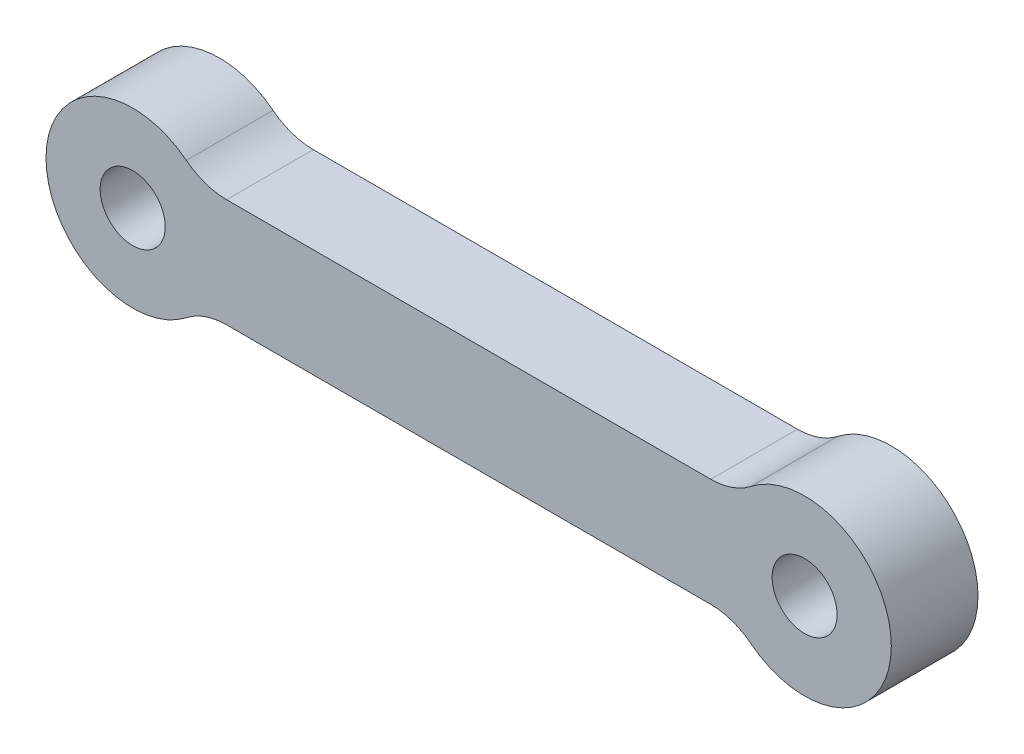
ISO-10303-21;
HEADER;
FILE_DESCRIPTION(('STEP AP214'),'2;1');
FILE_NAME('part.step','',(''),(''),'','','');
FILE_SCHEMA(('AUTOMOTIVE_DESIGN { 1 0 10303 214 1 1 1 1 }'));
ENDSEC;
DATA;
#1=APPLICATION_CONTEXT('core data for automotive mechanical design processes');
#2=APPLICATION_PROTOCOL_DEFINITION('international standard','automotive_design',2000,#1);
#3=PRODUCT_CONTEXT('',#1,'mechanical');
#4=PRODUCT('Part','Part','',(#3));
#5=PRODUCT_RELATED_PRODUCT_CATEGORY('part','',(#4));
#6=PRODUCT_DEFINITION_FORMATION('','',#4);
#7=PRODUCT_DEFINITION_CONTEXT('part definition',#1,'design');
#8=PRODUCT_DEFINITION('design','',#6,#7);
#9=PRODUCT_DEFINITION_SHAPE('','',#8);
#10=(LENGTH_UNIT() NAMED_UNIT(*) SI_UNIT(.MILLI.,.METRE.));
#11=(NAMED_UNIT(*) PLANE_ANGLE_UNIT() SI_UNIT($,.RADIAN.));
#12=(NAMED_UNIT(*) SI_UNIT($,.STERADIAN.) SOLID_ANGLE_UNIT());
#13=UNCERTAINTY_MEASURE_WITH_UNIT(LENGTH_MEASURE(1.E-05),#10,'distance_accuracy_value','');
#14=(GEOMETRIC_REPRESENTATION_CONTEXT(3) GLOBAL_UNCERTAINTY_ASSIGNED_CONTEXT((#13)) GLOBAL_UNIT_ASSIGNED_CONTEXT((#10,
#11,#12)) REPRESENTATION_CONTEXT('',''));
#15=CARTESIAN_POINT('',(0.,0.,0.));
#16=DIRECTION('',(0.,0.,1.));
#17=DIRECTION('',(1.,0.,0.));
#18=AXIS2_PLACEMENT_3D('',#15,#16,#17);
#19=CARTESIAN_POINT('',(11.1698729810778,5.5,4.));
#20=DIRECTION('',(0.,0.,1.));
#21=DIRECTION('',(1.,0.,0.));
#22=AXIS2_PLACEMENT_3D('',#19,#20,#21);
#23=PLANE('',#22);
#24=CARTESIAN_POINT('',(-15.5,0.,4.));
#25=DIRECTION('',(0.,0.,1.));
#26=DIRECTION('',(1.,0.,0.));
#27=AXIS2_PLACEMENT_3D('',#24,#25,#26);
#28=CIRCLE('',#27,1.5);
#29=CARTESIAN_POINT('',(-14.,0.,4.));
#30=VERTEX_POINT('',#29);
#31=EDGE_CURVE('E135',#30,#30,#28,.T.);
#32=ORIENTED_EDGE('',*,*,#31,.F.);
#33=EDGE_LOOP('',(#32));
#34=FACE_BOUND('',#33,.T.);
#35=CARTESIAN_POINT('',(11.1698729810778,5.5,4.));
#36=DIRECTION('',(0.,0.,-1.));
#37=DIRECTION('',(1.,0.,0.));
#38=AXIS2_PLACEMENT_3D('',#35,#36,#37);
#39=CIRCLE('',#38,3.);
#40=CARTESIAN_POINT('',(13.025641703473,3.14285714285714,4.));
#41=VERTEX_POINT('',#40);
#42=CARTESIAN_POINT('',(11.1698729810778,2.5,4.));
#43=VERTEX_POINT('',#42);
#44=EDGE_CURVE('E146',#41,#43,#39,.T.);
#45=ORIENTED_EDGE('',*,*,#44,.T.);
#46=DIRECTION('',(-1.,0.,0.));
#47=VECTOR('',#46,1.);
#48=CARTESIAN_POINT('',(-11.1698729810778,2.5,4.));
#49=LINE('',#48,#47);
#50=CARTESIAN_POINT('',(-11.1698729810778,2.5,4.));
#51=VERTEX_POINT('',#50);
#52=EDGE_CURVE('E94',#43,#51,#49,.T.);
#53=ORIENTED_EDGE('',*,*,#52,.T.);
#54=CARTESIAN_POINT('',(-11.1698729810778,5.5,4.));
#55=DIRECTION('',(0.,0.,-1.));
#56=DIRECTION('',(1.,0.,0.));
#57=AXIS2_PLACEMENT_3D('',#54,#55,#56);
#58=CIRCLE('',#57,3.);
#59=CARTESIAN_POINT('',(-13.025641703473,3.14285714285714,4.));
#60=VERTEX_POINT('',#59);
#61=EDGE_CURVE('E161',#51,#60,#58,.T.);
#62=ORIENTED_EDGE('',*,*,#61,.T.);
#63=CARTESIAN_POINT('',(-15.5,0.,4.));
#64=DIRECTION('',(0.,0.,1.));
#65=DIRECTION('',(1.,0.,0.));
#66=AXIS2_PLACEMENT_3D('',#63,#64,#65);
#67=CIRCLE('',#66,4.);
#68=CARTESIAN_POINT('',(-13.025641703473,-3.14285714285714,4.));
#69=VERTEX_POINT('',#68);
#70=EDGE_CURVE('E174',#60,#69,#67,.T.);
#71=ORIENTED_EDGE('',*,*,#70,.T.);
#72=CARTESIAN_POINT('',(-11.1698729810778,-5.5,4.));
#73=DIRECTION('',(0.,0.,-1.));
#74=DIRECTION('',(1.,0.,0.));
#75=AXIS2_PLACEMENT_3D('',#72,#73,#74);
#76=CIRCLE('',#75,3.);
#77=CARTESIAN_POINT('',(-11.1698729810778,-2.5,4.));
#78=VERTEX_POINT('',#77);
#79=EDGE_CURVE('E113',#69,#78,#76,.T.);
#80=ORIENTED_EDGE('',*,*,#79,.T.);
#81=DIRECTION('',(1.,0.,0.));
#82=VECTOR('',#81,1.);
#83=CARTESIAN_POINT('',(-11.1698729810778,-2.5,4.));
#84=LINE('',#83,#82);
#85=CARTESIAN_POINT('',(11.1698729810778,-2.5,4.));
#86=VERTEX_POINT('',#85);
#87=EDGE_CURVE('E107',#78,#86,#84,.T.);
#88=ORIENTED_EDGE('',*,*,#87,.T.);
#89=CARTESIAN_POINT('',(11.1698729810778,-5.5,4.));
#90=DIRECTION('',(0.,0.,-1.));
#91=DIRECTION('',(-1.,0.,0.));
#92=AXIS2_PLACEMENT_3D('',#89,#90,#91);
#93=CIRCLE('',#92,3.);
#94=CARTESIAN_POINT('',(13.025641703473,-3.14285714285714,4.));
#95=VERTEX_POINT('',#94);
#96=EDGE_CURVE('E111',#86,#95,#93,.T.);
#97=ORIENTED_EDGE('',*,*,#96,.T.);
#98=CARTESIAN_POINT('',(15.5,0.,4.));
#99=DIRECTION('',(0.,0.,1.));
#100=DIRECTION('',(-1.,0.,0.));
#101=AXIS2_PLACEMENT_3D('',#98,#99,#100);
#102=CIRCLE('',#101,4.);
#103=EDGE_CURVE('E51',#95,#41,#102,.T.);
#104=ORIENTED_EDGE('',*,*,#103,.T.);
#105=EDGE_LOOP('',(#45,#53,#62,#71,#80,#88,#97,#104));
#106=FACE_BOUND('',#105,.T.);
#107=CARTESIAN_POINT('',(15.5,0.,4.));
#108=DIRECTION('',(0.,0.,1.));
#109=DIRECTION('',(-1.,0.,0.));
#110=AXIS2_PLACEMENT_3D('',#107,#108,#109);
#111=CIRCLE('',#110,1.5);
#112=CARTESIAN_POINT('',(14.,0.,4.));
#113=VERTEX_POINT('',#112);
#114=EDGE_CURVE('E183',#113,#113,#111,.T.);
#115=ORIENTED_EDGE('',*,*,#114,.F.);
#116=EDGE_LOOP('',(#115));
#117=FACE_BOUND('',#116,.T.);
#118=ADVANCED_FACE('F34',(#34,#106,#117),#23,.T.);
#119=CARTESIAN_POINT('',(11.1698729810778,5.5,0.));
#120=DIRECTION('',(0.,0.,1.));
#121=DIRECTION('',(1.,0.,0.));
#122=AXIS2_PLACEMENT_3D('',#119,#120,#121);
#123=PLANE('',#122);
#124=CARTESIAN_POINT('',(11.1698729810778,5.5,0.));
#125=DIRECTION('',(0.,0.,-1.));
#126=DIRECTION('',(1.,0.,0.));
#127=AXIS2_PLACEMENT_3D('',#124,#125,#126);
#128=CIRCLE('',#127,3.);
#129=CARTESIAN_POINT('',(13.025641703473,3.14285714285714,0.));
#130=VERTEX_POINT('',#129);
#131=CARTESIAN_POINT('',(11.1698729810778,2.5,0.));
#132=VERTEX_POINT('',#131);
#133=EDGE_CURVE('E131',#130,#132,#128,.T.);
#134=ORIENTED_EDGE('',*,*,#133,.F.);
#135=CARTESIAN_POINT('',(15.5,0.,0.));
#136=DIRECTION('',(0.,0.,1.));
#137=DIRECTION('',(-1.,0.,0.));
#138=AXIS2_PLACEMENT_3D('',#135,#136,#137);
#139=CIRCLE('',#138,4.);
#140=CARTESIAN_POINT('',(13.025641703473,-3.14285714285714,0.));
#141=VERTEX_POINT('',#140);
#142=EDGE_CURVE('E86',#141,#130,#139,.T.);
#143=ORIENTED_EDGE('',*,*,#142,.F.);
#144=CARTESIAN_POINT('',(11.1698729810778,-5.5,0.));
#145=DIRECTION('',(0.,0.,-1.));
#146=DIRECTION('',(-1.,0.,0.));
#147=AXIS2_PLACEMENT_3D('',#144,#145,#146);
#148=CIRCLE('',#147,3.);
#149=CARTESIAN_POINT('',(11.1698729810778,-2.5,0.));
#150=VERTEX_POINT('',#149);
#151=EDGE_CURVE('E80',#150,#141,#148,.T.);
#152=ORIENTED_EDGE('',*,*,#151,.F.);
#153=DIRECTION('',(1.,0.,0.));
#154=VECTOR('',#153,1.);
#155=CARTESIAN_POINT('',(-11.1698729810778,-2.5,0.));
#156=LINE('',#155,#154);
#157=CARTESIAN_POINT('',(-11.1698729810778,-2.5,0.));
#158=VERTEX_POINT('',#157);
#159=EDGE_CURVE('E121',#158,#150,#156,.T.);
#160=ORIENTED_EDGE('',*,*,#159,.F.);
#161=CARTESIAN_POINT('',(-11.1698729810778,-5.5,0.));
#162=DIRECTION('',(0.,0.,-1.));
#163=DIRECTION('',(1.,0.,0.));
#164=AXIS2_PLACEMENT_3D('',#161,#162,#163);
#165=CIRCLE('',#164,3.);
#166=CARTESIAN_POINT('',(-13.025641703473,-3.14285714285714,0.));
#167=VERTEX_POINT('',#166);
#168=EDGE_CURVE('E141',#167,#158,#165,.T.);
#169=ORIENTED_EDGE('',*,*,#168,.F.);
#170=CARTESIAN_POINT('',(-15.5,0.,0.));
#171=DIRECTION('',(0.,0.,1.));
#172=DIRECTION('',(1.,0.,0.));
#173=AXIS2_PLACEMENT_3D('',#170,#171,#172);
#174=CIRCLE('',#173,4.);
#175=CARTESIAN_POINT('',(-13.025641703473,3.14285714285714,0.));
#176=VERTEX_POINT('',#175);
#177=EDGE_CURVE('E139',#176,#167,#174,.T.);
#178=ORIENTED_EDGE('',*,*,#177,.F.);
#179=CARTESIAN_POINT('',(-11.1698729810778,5.5,0.));
#180=DIRECTION('',(0.,0.,-1.));
#181=DIRECTION('',(1.,0.,0.));
#182=AXIS2_PLACEMENT_3D('',#179,#180,#181);
#183=CIRCLE('',#182,3.);
#184=CARTESIAN_POINT('',(-11.1698729810778,2.5,0.));
#185=VERTEX_POINT('',#184);
#186=EDGE_CURVE('E137',#185,#176,#183,.T.);
#187=ORIENTED_EDGE('',*,*,#186,.F.);
#188=DIRECTION('',(-1.,0.,0.));
#189=VECTOR('',#188,1.);
#190=CARTESIAN_POINT('',(-11.1698729810778,2.5,0.));
#191=LINE('',#190,#189);
#192=EDGE_CURVE('E134',#132,#185,#191,.T.);
#193=ORIENTED_EDGE('',*,*,#192,.F.);
#194=EDGE_LOOP('',(#134,#143,#152,#160,#169,#178,#187,#193));
#195=FACE_BOUND('',#194,.T.);
#196=CARTESIAN_POINT('',(-15.5,0.,0.));
#197=DIRECTION('',(0.,0.,1.));
#198=DIRECTION('',(1.,0.,0.));
#199=AXIS2_PLACEMENT_3D('',#196,#197,#198);
#200=CIRCLE('',#199,1.5);
#201=CARTESIAN_POINT('',(-14.,0.,0.));
#202=VERTEX_POINT('',#201);
#203=EDGE_CURVE('E180',#202,#202,#200,.T.);
#204=ORIENTED_EDGE('',*,*,#203,.T.);
#205=EDGE_LOOP('',(#204));
#206=FACE_BOUND('',#205,.T.);
#207=CARTESIAN_POINT('',(15.5,0.,0.));
#208=DIRECTION('',(0.,0.,1.));
#209=DIRECTION('',(-1.,0.,0.));
#210=AXIS2_PLACEMENT_3D('',#207,#208,#209);
#211=CIRCLE('',#210,1.5);
#212=CARTESIAN_POINT('',(14.,0.,0.));
#213=VERTEX_POINT('',#212);
#214=EDGE_CURVE('E186',#213,#213,#211,.T.);
#215=ORIENTED_EDGE('',*,*,#214,.T.);
#216=EDGE_LOOP('',(#215));
#217=FACE_BOUND('',#216,.T.);
#218=ADVANCED_FACE('F165',(#195,#206,#217),#123,.F.);
#219=CARTESIAN_POINT('',(11.1698729810778,5.5,4.));
#220=DIRECTION('',(0.,0.,-1.));
#221=DIRECTION('',(-1.,0.,0.));
#222=AXIS2_PLACEMENT_3D('',#219,#220,#221);
#223=CYLINDRICAL_SURFACE('',#222,3.);
#224=ORIENTED_EDGE('',*,*,#133,.T.);
#225=DIRECTION('',(0.,0.,-1.));
#226=VECTOR('',#225,1.);
#227=CARTESIAN_POINT('',(11.1698729810778,2.5,4.));
#228=LINE('',#227,#226);
#229=EDGE_CURVE('E11',#43,#132,#228,.T.);
#230=ORIENTED_EDGE('',*,*,#229,.F.);
#231=ORIENTED_EDGE('',*,*,#44,.F.);
#232=DIRECTION('',(0.,0.,-1.));
#233=VECTOR('',#232,1.);
#234=CARTESIAN_POINT('',(13.025641703473,3.14285714285714,4.));
#235=LINE('',#234,#233);
#236=EDGE_CURVE('E127',#41,#130,#235,.T.);
#237=ORIENTED_EDGE('',*,*,#236,.T.);
#238=EDGE_LOOP('',(#224,#230,#231,#237));
#239=FACE_BOUND('',#238,.T.);
#240=ADVANCED_FACE('F36',(#239),#223,.F.);
#241=CARTESIAN_POINT('',(-11.1698729810778,2.5,4.));
#242=DIRECTION('',(0.,-1.,0.));
#243=DIRECTION('',(0.,0.,-1.));
#244=AXIS2_PLACEMENT_3D('',#241,#242,#243);
#245=PLANE('',#244);
#246=ORIENTED_EDGE('',*,*,#192,.T.);
#247=DIRECTION('',(0.,0.,-1.));
#248=VECTOR('',#247,1.);
#249=CARTESIAN_POINT('',(-11.1698729810778,2.5,4.));
#250=LINE('',#249,#248);
#251=EDGE_CURVE('E43',#51,#185,#250,.T.);
#252=ORIENTED_EDGE('',*,*,#251,.F.);
#253=ORIENTED_EDGE('',*,*,#52,.F.);
#254=ORIENTED_EDGE('',*,*,#229,.T.);
#255=EDGE_LOOP('',(#246,#252,#253,#254));
#256=FACE_BOUND('',#255,.T.);
#257=ADVANCED_FACE('F218',(#256),#245,.F.);
#258=CARTESIAN_POINT('',(-11.1698729810778,5.5,4.));
#259=DIRECTION('',(0.,0.,-1.));
#260=DIRECTION('',(-1.,0.,0.));
#261=AXIS2_PLACEMENT_3D('',#258,#259,#260);
#262=CYLINDRICAL_SURFACE('',#261,3.);
#263=ORIENTED_EDGE('',*,*,#186,.T.);
#264=DIRECTION('',(0.,0.,-1.));
#265=VECTOR('',#264,1.);
#266=CARTESIAN_POINT('',(-13.025641703473,3.14285714285714,4.));
#267=LINE('',#266,#265);
#268=EDGE_CURVE('E153',#60,#176,#267,.T.);
#269=ORIENTED_EDGE('',*,*,#268,.F.);
#270=ORIENTED_EDGE('',*,*,#61,.F.);
#271=ORIENTED_EDGE('',*,*,#251,.T.);
#272=EDGE_LOOP('',(#263,#269,#270,#271));
#273=FACE_BOUND('',#272,.T.);
#274=ADVANCED_FACE('F159',(#273),#262,.F.);
#275=CARTESIAN_POINT('',(-15.5,0.,4.));
#276=DIRECTION('',(0.,0.,-1.));
#277=DIRECTION('',(-1.,0.,0.));
#278=AXIS2_PLACEMENT_3D('',#275,#276,#277);
#279=CYLINDRICAL_SURFACE('',#278,4.);
#280=ORIENTED_EDGE('',*,*,#177,.T.);
#281=DIRECTION('',(0.,0.,-1.));
#282=VECTOR('',#281,1.);
#283=CARTESIAN_POINT('',(-13.025641703473,-3.14285714285714,4.));
#284=LINE('',#283,#282);
#285=EDGE_CURVE('E150',#69,#167,#284,.T.);
#286=ORIENTED_EDGE('',*,*,#285,.F.);
#287=ORIENTED_EDGE('',*,*,#70,.F.);
#288=ORIENTED_EDGE('',*,*,#268,.T.);
#289=EDGE_LOOP('',(#280,#286,#287,#288));
#290=FACE_BOUND('',#289,.T.);
#291=ADVANCED_FACE('F170',(#290),#279,.T.);
#292=CARTESIAN_POINT('',(-11.1698729810778,-5.5,4.));
#293=DIRECTION('',(0.,0.,-1.));
#294=DIRECTION('',(-1.,0.,0.));
#295=AXIS2_PLACEMENT_3D('',#292,#293,#294);
#296=CYLINDRICAL_SURFACE('',#295,3.);
#297=ORIENTED_EDGE('',*,*,#168,.T.);
#298=DIRECTION('',(0.,0.,-1.));
#299=VECTOR('',#298,1.);
#300=CARTESIAN_POINT('',(-11.1698729810778,-2.5,4.));
#301=LINE('',#300,#299);
#302=EDGE_CURVE('E122',#78,#158,#301,.T.);
#303=ORIENTED_EDGE('',*,*,#302,.F.);
#304=ORIENTED_EDGE('',*,*,#79,.F.);
#305=ORIENTED_EDGE('',*,*,#285,.T.);
#306=EDGE_LOOP('',(#297,#303,#304,#305));
#307=FACE_BOUND('',#306,.T.);
#308=ADVANCED_FACE('F173',(#307),#296,.F.);
#309=CARTESIAN_POINT('',(-11.1698729810778,-2.5,4.));
#310=DIRECTION('',(0.,1.,0.));
#311=DIRECTION('',(0.,0.,1.));
#312=AXIS2_PLACEMENT_3D('',#309,#310,#311);
#313=PLANE('',#312);
#314=ORIENTED_EDGE('',*,*,#159,.T.);
#315=DIRECTION('',(0.,0.,-1.));
#316=VECTOR('',#315,1.);
#317=CARTESIAN_POINT('',(11.1698729810778,-2.5,4.));
#318=LINE('',#317,#316);
#319=EDGE_CURVE('E118',#86,#150,#318,.T.);
#320=ORIENTED_EDGE('',*,*,#319,.F.);
#321=ORIENTED_EDGE('',*,*,#87,.F.);
#322=ORIENTED_EDGE('',*,*,#302,.T.);
#323=EDGE_LOOP('',(#314,#320,#321,#322));
#324=FACE_BOUND('',#323,.T.);
#325=ADVANCED_FACE('F119',(#324),#313,.F.);
#326=CARTESIAN_POINT('',(11.1698729810778,-5.5,4.));
#327=DIRECTION('',(0.,0.,-1.));
#328=DIRECTION('',(-1.,0.,0.));
#329=AXIS2_PLACEMENT_3D('',#326,#327,#328);
#330=CYLINDRICAL_SURFACE('',#329,3.);
#331=ORIENTED_EDGE('',*,*,#151,.T.);
#332=DIRECTION('',(0.,0.,-1.));
#333=VECTOR('',#332,1.);
#334=CARTESIAN_POINT('',(13.025641703473,-3.14285714285714,4.));
#335=LINE('',#334,#333);
#336=EDGE_CURVE('E123',#95,#141,#335,.T.);
#337=ORIENTED_EDGE('',*,*,#336,.F.);
#338=ORIENTED_EDGE('',*,*,#96,.F.);
#339=ORIENTED_EDGE('',*,*,#319,.T.);
#340=EDGE_LOOP('',(#331,#337,#338,#339));
#341=FACE_BOUND('',#340,.T.);
#342=ADVANCED_FACE('F125',(#341),#330,.F.);
#343=CARTESIAN_POINT('',(15.5,0.,4.));
#344=DIRECTION('',(0.,0.,-1.));
#345=DIRECTION('',(-1.,0.,0.));
#346=AXIS2_PLACEMENT_3D('',#343,#344,#345);
#347=CYLINDRICAL_SURFACE('',#346,4.);
#348=ORIENTED_EDGE('',*,*,#142,.T.);
#349=ORIENTED_EDGE('',*,*,#236,.F.);
#350=ORIENTED_EDGE('',*,*,#103,.F.);
#351=ORIENTED_EDGE('',*,*,#336,.T.);
#352=EDGE_LOOP('',(#348,#349,#350,#351));
#353=FACE_BOUND('',#352,.T.);
#354=ADVANCED_FACE('F206',(#353),#347,.T.);
#355=CARTESIAN_POINT('',(-15.5,0.,4.));
#356=DIRECTION('',(0.,0.,-1.));
#357=DIRECTION('',(-1.,0.,0.));
#358=AXIS2_PLACEMENT_3D('',#355,#356,#357);
#359=CYLINDRICAL_SURFACE('',#358,1.5);
#360=ORIENTED_EDGE('',*,*,#31,.T.);
#361=EDGE_LOOP('',(#360));
#362=FACE_BOUND('',#361,.T.);
#363=ORIENTED_EDGE('',*,*,#203,.F.);
#364=EDGE_LOOP('',(#363));
#365=FACE_BOUND('',#364,.T.);
#366=ADVANCED_FACE('F203',(#362,#365),#359,.F.);
#367=CARTESIAN_POINT('',(15.5,0.,4.));
#368=DIRECTION('',(0.,0.,-1.));
#369=DIRECTION('',(-1.,0.,0.));
#370=AXIS2_PLACEMENT_3D('',#367,#368,#369);
#371=CYLINDRICAL_SURFACE('',#370,1.5);
#372=ORIENTED_EDGE('',*,*,#114,.T.);
#373=EDGE_LOOP('',(#372));
#374=FACE_BOUND('',#373,.T.);
#375=ORIENTED_EDGE('',*,*,#214,.F.);
#376=EDGE_LOOP('',(#375));
#377=FACE_BOUND('',#376,.T.);
#378=ADVANCED_FACE('F192',(#374,#377),#371,.F.);
#379=CLOSED_SHELL('',(#118,#218,#240,#257,#274,#291,#308,#325,#342,#354,#366,#378));
#380=MANIFOLD_SOLID_BREP('B2',#379);
#381=ADVANCED_BREP_SHAPE_REPRESENTATION('',(#18,#380),#14);
#382=SHAPE_DEFINITION_REPRESENTATION(#9,#381);
ENDSEC;
END-ISO-10303-21;
